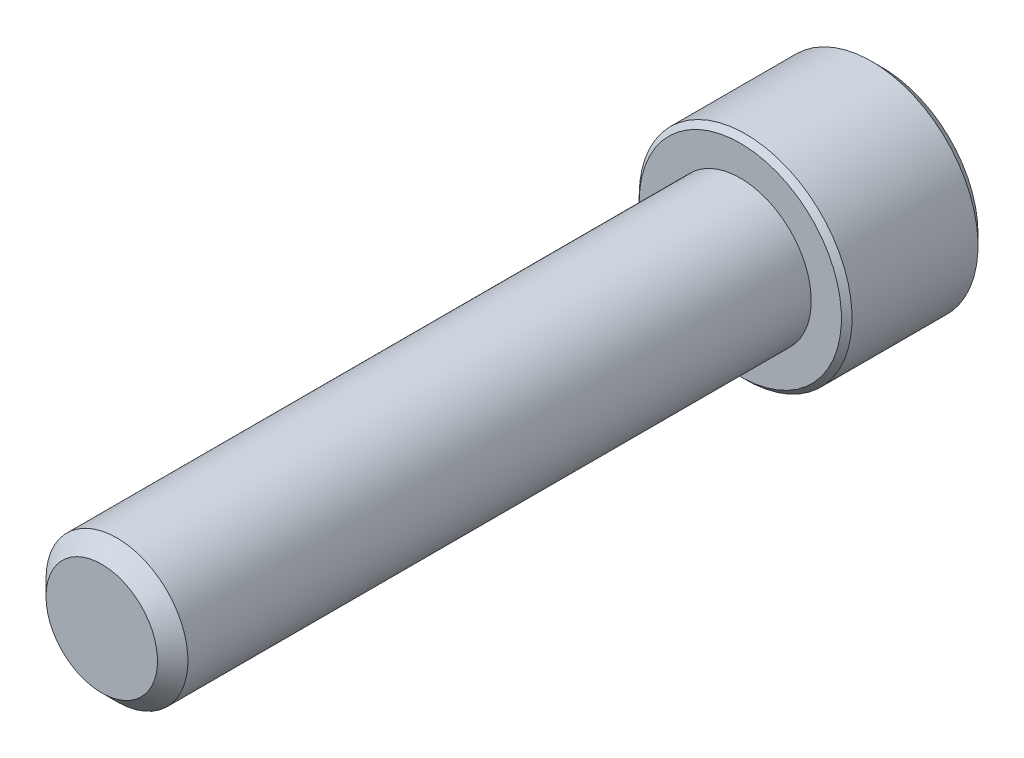
ISO-10303-21;
HEADER;
FILE_DESCRIPTION(('STEP AP214'),'2;1');
FILE_NAME('part.step','',(''),(''),'','','');
FILE_SCHEMA(('AUTOMOTIVE_DESIGN { 1 0 10303 214 1 1 1 1 }'));
ENDSEC;
DATA;
#1=APPLICATION_CONTEXT('core data for automotive mechanical design processes');
#2=APPLICATION_PROTOCOL_DEFINITION('international standard','automotive_design',2000,#1);
#3=PRODUCT_CONTEXT('',#1,'mechanical');
#4=PRODUCT('Part','Part','',(#3));
#5=PRODUCT_RELATED_PRODUCT_CATEGORY('part','',(#4));
#6=PRODUCT_DEFINITION_FORMATION('','',#4);
#7=PRODUCT_DEFINITION_CONTEXT('part definition',#1,'design');
#8=PRODUCT_DEFINITION('design','',#6,#7);
#9=PRODUCT_DEFINITION_SHAPE('','',#8);
#10=(LENGTH_UNIT() NAMED_UNIT(*) SI_UNIT(.MILLI.,.METRE.));
#11=(NAMED_UNIT(*) PLANE_ANGLE_UNIT() SI_UNIT($,.RADIAN.));
#12=(NAMED_UNIT(*) SI_UNIT($,.STERADIAN.) SOLID_ANGLE_UNIT());
#13=UNCERTAINTY_MEASURE_WITH_UNIT(LENGTH_MEASURE(1.E-05),#10,'distance_accuracy_value','');
#14=(GEOMETRIC_REPRESENTATION_CONTEXT(3) GLOBAL_UNCERTAINTY_ASSIGNED_CONTEXT((#13)) GLOBAL_UNIT_ASSIGNED_CONTEXT((#10,
#11,#12)) REPRESENTATION_CONTEXT('',''));
#15=CARTESIAN_POINT('',(0.,0.,0.));
#16=DIRECTION('',(0.,0.,1.));
#17=DIRECTION('',(1.,0.,0.));
#18=AXIS2_PLACEMENT_3D('',#15,#16,#17);
#19=CARTESIAN_POINT('',(0.,0.,-28.575));
#20=DIRECTION('',(0.,0.,1.));
#21=DIRECTION('',(1.,0.,0.));
#22=AXIS2_PLACEMENT_3D('',#19,#20,#21);
#23=CYLINDRICAL_SURFACE('',#22,3.175);
#24=CARTESIAN_POINT('',(0.,0.,-0.680357142857146));
#25=DIRECTION('',(0.,0.,1.));
#26=DIRECTION('',(1.,0.,0.));
#27=AXIS2_PLACEMENT_3D('',#24,#25,#26);
#28=CIRCLE('',#27,3.175);
#29=CARTESIAN_POINT('',(-3.175,0.,-0.680357142857146));
#30=VERTEX_POINT('',#29);
#31=EDGE_CURVE('E116',#30,#30,#28,.F.);
#32=ORIENTED_EDGE('',*,*,#31,.T.);
#33=EDGE_LOOP('',(#32));
#34=FACE_BOUND('',#33,.T.);
#35=CARTESIAN_POINT('',(0.,0.,-28.575));
#36=DIRECTION('',(0.,0.,-1.));
#37=DIRECTION('',(-1.,0.,0.));
#38=AXIS2_PLACEMENT_3D('',#35,#36,#37);
#39=CIRCLE('',#38,3.175);
#40=CARTESIAN_POINT('',(-3.175,0.,-28.575));
#41=VERTEX_POINT('',#40);
#42=EDGE_CURVE('E228',#41,#41,#39,.F.);
#43=ORIENTED_EDGE('',*,*,#42,.T.);
#44=EDGE_LOOP('',(#43));
#45=FACE_BOUND('',#44,.T.);
#46=ADVANCED_FACE('F39',(#34,#45),#23,.T.);
#47=CARTESIAN_POINT('',(0.,0.,0.));
#48=DIRECTION('',(0.,0.,1.));
#49=DIRECTION('',(1.,0.,0.));
#50=AXIS2_PLACEMENT_3D('',#47,#48,#49);
#51=PLANE('',#50);
#52=CARTESIAN_POINT('',(0.,0.,0.));
#53=DIRECTION('',(0.,0.,1.));
#54=DIRECTION('',(1.,0.,0.));
#55=AXIS2_PLACEMENT_3D('',#52,#53,#54);
#56=CIRCLE('',#55,2.49464285714286);
#57=CARTESIAN_POINT('',(-2.49464285714286,0.,0.));
#58=VERTEX_POINT('',#57);
#59=EDGE_CURVE('E226',#58,#58,#56,.T.);
#60=ORIENTED_EDGE('',*,*,#59,.T.);
#61=EDGE_LOOP('',(#60));
#62=FACE_BOUND('',#61,.T.);
#63=ADVANCED_FACE('F204',(#62),#51,.T.);
#64=CARTESIAN_POINT('',(0.,0.,0.));
#65=DIRECTION('',(0.,0.,-1.));
#66=DIRECTION('',(-1.,0.,0.));
#67=AXIS2_PLACEMENT_3D('',#64,#65,#66);
#68=CONICAL_SURFACE('',#67,2.49464285714286,0.785398163397448);
#69=CARTESIAN_POINT('',(-3.175,0.,-0.680357142857146));
#70=CARTESIAN_POINT('',(-3.16791294642857,0.,-0.673270089285717));
#71=CARTESIAN_POINT('',(-3.16082589285714,0.,-0.666183035714289));
#72=CARTESIAN_POINT('',(-3.14665178571429,0.,-0.652008928571431));
#73=CARTESIAN_POINT('',(-3.13956473214286,0.,-0.644921875000003));
#74=CARTESIAN_POINT('',(-3.125390625,0.,-0.630747767857146));
#75=CARTESIAN_POINT('',(-3.11830357142857,0.,-0.623660714285717));
#76=CARTESIAN_POINT('',(-3.10412946428571,0.,-0.60948660714286));
#77=CARTESIAN_POINT('',(-3.09704241071429,0.,-0.602399553571431));
#78=CARTESIAN_POINT('',(-3.08286830357143,0.,-0.588225446428574));
#79=CARTESIAN_POINT('',(-3.07578125,0.,-0.581138392857145));
#80=CARTESIAN_POINT('',(-3.06160714285714,0.,-0.566964285714288));
#81=CARTESIAN_POINT('',(-3.05452008928571,0.,-0.55987723214286));
#82=CARTESIAN_POINT('',(-3.04034598214286,0.,-0.545703125000003));
#83=CARTESIAN_POINT('',(-3.03325892857143,0.,-0.538616071428574));
#84=CARTESIAN_POINT('',(-3.01908482142857,0.,-0.524441964285716));
#85=CARTESIAN_POINT('',(-3.01199776785714,0.,-0.517354910714288));
#86=CARTESIAN_POINT('',(-2.99782366071428,0.,-0.503180803571431));
#87=CARTESIAN_POINT('',(-2.99073660714286,0.,-0.496093750000002));
#88=CARTESIAN_POINT('',(-2.9765625,0.,-0.481919642857145));
#89=CARTESIAN_POINT('',(-2.96947544642857,0.,-0.474832589285716));
#90=CARTESIAN_POINT('',(-2.95530133928571,0.,-0.460658482142859));
#91=CARTESIAN_POINT('',(-2.94821428571429,0.,-0.453571428571431));
#92=CARTESIAN_POINT('',(-2.93404017857143,0.,-0.439397321428573));
#93=CARTESIAN_POINT('',(-2.926953125,0.,-0.432310267857145));
#94=CARTESIAN_POINT('',(-2.91277901785714,0.,-0.418136160714288));
#95=CARTESIAN_POINT('',(-2.90569196428571,0.,-0.411049107142859));
#96=CARTESIAN_POINT('',(-2.89151785714286,0.,-0.396875000000002));
#97=CARTESIAN_POINT('',(-2.88443080357143,0.,-0.389787946428573));
#98=CARTESIAN_POINT('',(-2.87025669642857,0.,-0.375613839285716));
#99=CARTESIAN_POINT('',(-2.86316964285714,0.,-0.368526785714287));
#100=CARTESIAN_POINT('',(-2.84899553571428,0.,-0.35435267857143));
#101=CARTESIAN_POINT('',(-2.84190848214286,0.,-0.347265625000002));
#102=CARTESIAN_POINT('',(-2.827734375,0.,-0.333091517857144));
#103=CARTESIAN_POINT('',(-2.82064732142857,0.,-0.326004464285716));
#104=CARTESIAN_POINT('',(-2.80647321428571,0.,-0.311830357142859));
#105=CARTESIAN_POINT('',(-2.79938616071428,0.,-0.30474330357143));
#106=CARTESIAN_POINT('',(-2.78521205357143,0.,-0.290569196428573));
#107=CARTESIAN_POINT('',(-2.778125,0.,-0.283482142857144));
#108=CARTESIAN_POINT('',(-2.76395089285714,0.,-0.269308035714287));
#109=CARTESIAN_POINT('',(-2.75686383928571,0.,-0.262220982142858));
#110=CARTESIAN_POINT('',(-2.74268973214286,0.,-0.248046875000001));
#111=CARTESIAN_POINT('',(-2.73560267857143,0.,-0.240959821428572));
#112=CARTESIAN_POINT('',(-2.72142857142857,0.,-0.226785714285715));
#113=CARTESIAN_POINT('',(-2.71434151785714,0.,-0.219698660714287));
#114=CARTESIAN_POINT('',(-2.70016741071428,0.,-0.20552455357143));
#115=CARTESIAN_POINT('',(-2.69308035714286,0.,-0.198437500000001));
#116=CARTESIAN_POINT('',(-2.67890625,0.,-0.184263392857144));
#117=CARTESIAN_POINT('',(-2.67181919642857,0.,-0.177176339285715));
#118=CARTESIAN_POINT('',(-2.65764508928571,0.,-0.163002232142858));
#119=CARTESIAN_POINT('',(-2.65055803571428,0.,-0.155915178571429));
#120=CARTESIAN_POINT('',(-2.63638392857143,0.,-0.141741071428572));
#121=CARTESIAN_POINT('',(-2.629296875,0.,-0.134654017857143));
#122=CARTESIAN_POINT('',(-2.61512276785714,0.,-0.120479910714286));
#123=CARTESIAN_POINT('',(-2.60803571428571,0.,-0.113392857142858));
#124=CARTESIAN_POINT('',(-2.59386160714286,0.,-0.0992187500000004));
#125=CARTESIAN_POINT('',(-2.58677455357143,0.,-0.0921316964285718));
#126=CARTESIAN_POINT('',(-2.57260044642857,0.,-0.0779575892857146));
#127=CARTESIAN_POINT('',(-2.56551339285714,0.,-0.070870535714286));
#128=CARTESIAN_POINT('',(-2.55133928571428,0.,-0.0566964285714288));
#129=CARTESIAN_POINT('',(-2.54425223214286,0.,-0.0496093750000002));
#130=CARTESIAN_POINT('',(-2.530078125,0.,-0.035435267857143));
#131=CARTESIAN_POINT('',(-2.52299107142857,0.,-0.0283482142857144));
#132=CARTESIAN_POINT('',(-2.50881696428571,0.,-0.0141741071428571));
#133=CARTESIAN_POINT('',(-2.50172991071428,0.,-0.00708705357142851));
#134=CARTESIAN_POINT('',(-2.49464285714286,0.,0.));
#135=B_SPLINE_CURVE_WITH_KNOTS('',3,(#69,#70,#71,#72,#73,#74,#75,#76,#77,#78,#79,#80,#81,#82,
#83,#84,#85,#86,#87,#88,#89,#90,#91,#92,#93,#94,#95,#96,#97,#98,#99,#100,#101,#102,#103,#104,
#105,#106,#107,#108,#109,#110,#111,#112,#113,#114,#115,#116,#117,#118,#119,#120,#121,#122,#123,
#124,#125,#126,#127,#128,#129,#130,#131,#132,#133,#134),.UNSPECIFIED.,.F.,.F.,(4,2,2,2,2,2,2,2,
2,2,2,2,2,2,2,2,2,2,2,2,2,2,2,2,2,2,2,2,2,2,2,2,4),(0.,0.0300678218339368,0.0601356436678739,
0.090203465501811,0.120271287335748,0.150339109169685,0.180406931003622,0.210474752837559,
0.240542574671496,0.270610396505433,0.30067821833937,0.330746040173307,0.360813862007244,
0.390881683841181,0.420949505675118,0.451017327509055,0.481085149342992,0.511152971176929,
0.541220793010866,0.571288614844803,0.60135643667874,0.631424258512677,0.661492080346614,
0.691559902180551,0.721627724014488,0.751695545848425,0.781763367682362,0.8118311895163,
0.841899011350236,0.871966833184173,0.902034655018111,0.932102476852047,0.962170298685984),.UNSPECIFIED.);
#136=EDGE_CURVE('BSEAM210',#30,#58,#135,.T.);
#137=ORIENTED_EDGE('',*,*,#31,.F.);
#138=ORIENTED_EDGE('',*,*,#59,.F.);
#139=ORIENTED_EDGE('',*,*,#136,.T.);
#140=ORIENTED_EDGE('',*,*,#136,.F.);
#141=EDGE_LOOP('',(#137,#139,#138,#140));
#142=FACE_BOUND('',#141,.T.);
#143=ADVANCED_FACE('F210',(#142),#68,.T.);
#144=CARTESIAN_POINT('',(0.,0.,-34.925));
#145=DIRECTION('',(0.,0.,1.));
#146=DIRECTION('',(1.,0.,0.));
#147=AXIS2_PLACEMENT_3D('',#144,#145,#146);
#148=CYLINDRICAL_SURFACE('',#147,4.7625);
#149=CARTESIAN_POINT('',(0.,0.,-28.813125));
#150=DIRECTION('',(0.,0.,-1.));
#151=DIRECTION('',(-1.,0.,0.));
#152=AXIS2_PLACEMENT_3D('',#149,#150,#151);
#153=CIRCLE('',#152,4.7625);
#154=CARTESIAN_POINT('',(-4.7625,0.,-28.813125));
#155=VERTEX_POINT('',#154);
#156=EDGE_CURVE('E48',#155,#155,#153,.T.);
#157=ORIENTED_EDGE('',*,*,#156,.T.);
#158=EDGE_LOOP('',(#157));
#159=FACE_BOUND('',#158,.T.);
#160=CARTESIAN_POINT('',(0.,0.,-34.44875));
#161=DIRECTION('',(0.,0.,-1.));
#162=DIRECTION('',(-1.,0.,0.));
#163=AXIS2_PLACEMENT_3D('',#160,#161,#162);
#164=CIRCLE('',#163,4.7625);
#165=CARTESIAN_POINT('',(-4.7625,0.,-34.44875));
#166=VERTEX_POINT('',#165);
#167=EDGE_CURVE('E185',#166,#166,#164,.F.);
#168=ORIENTED_EDGE('',*,*,#167,.T.);
#169=EDGE_LOOP('',(#168));
#170=FACE_BOUND('',#169,.T.);
#171=ADVANCED_FACE('F192',(#159,#170),#148,.T.);
#172=CARTESIAN_POINT('',(0.,0.,-34.925));
#173=DIRECTION('',(0.,0.,-1.));
#174=DIRECTION('',(-1.,0.,0.));
#175=AXIS2_PLACEMENT_3D('',#172,#173,#174);
#176=PLANE('',#175);
#177=CARTESIAN_POINT('',(0.,0.,-34.925));
#178=DIRECTION('',(0.,0.,-1.));
#179=DIRECTION('',(-1.,0.,0.));
#180=AXIS2_PLACEMENT_3D('',#177,#178,#179);
#181=CIRCLE('',#180,4.28625000000001);
#182=CARTESIAN_POINT('',(-4.28625000000001,0.,-34.925));
#183=VERTEX_POINT('',#182);
#184=EDGE_CURVE('E115',#183,#183,#181,.T.);
#185=ORIENTED_EDGE('',*,*,#184,.T.);
#186=EDGE_LOOP('',(#185));
#187=FACE_BOUND('',#186,.T.);
#188=CARTESIAN_POINT('',(0.,0.,-34.925));
#189=DIRECTION('',(0.,0.,-1.));
#190=DIRECTION('',(-1.,0.,0.));
#191=AXIS2_PLACEMENT_3D('',#188,#189,#190);
#192=CIRCLE('',#191,2.74963065701559);
#193=CARTESIAN_POINT('',(-2.38125,1.37481532850779,-34.925));
#194=VERTEX_POINT('',#193);
#195=CARTESIAN_POINT('',(0.,2.74963065701559,-34.925));
#196=VERTEX_POINT('',#195);
#197=EDGE_CURVE('E94',#194,#196,#192,.T.);
#198=ORIENTED_EDGE('',*,*,#197,.F.);
#199=CARTESIAN_POINT('',(-2.38125,-1.3748153285078,-34.925));
#200=VERTEX_POINT('',#199);
#201=EDGE_CURVE('E54',#200,#194,#192,.T.);
#202=ORIENTED_EDGE('',*,*,#201,.F.);
#203=CARTESIAN_POINT('',(0.,-2.74963065701559,-34.925));
#204=VERTEX_POINT('',#203);
#205=EDGE_CURVE('E301',#204,#200,#192,.T.);
#206=ORIENTED_EDGE('',*,*,#205,.F.);
#207=CARTESIAN_POINT('',(2.38125,-1.3748153285078,-34.925));
#208=VERTEX_POINT('',#207);
#209=EDGE_CURVE('E61',#208,#204,#192,.T.);
#210=ORIENTED_EDGE('',*,*,#209,.F.);
#211=CARTESIAN_POINT('',(2.38125,1.3748153285078,-34.925));
#212=VERTEX_POINT('',#211);
#213=EDGE_CURVE('E139',#212,#208,#192,.T.);
#214=ORIENTED_EDGE('',*,*,#213,.F.);
#215=EDGE_CURVE('E104',#196,#212,#192,.T.);
#216=ORIENTED_EDGE('',*,*,#215,.F.);
#217=EDGE_LOOP('',(#198,#202,#206,#210,#214,#216));
#218=FACE_BOUND('',#217,.T.);
#219=ADVANCED_FACE('F138',(#187,#218),#176,.T.);
#220=CARTESIAN_POINT('',(0.,0.,-28.575));
#221=DIRECTION('',(0.,0.,-1.));
#222=DIRECTION('',(-1.,0.,0.));
#223=AXIS2_PLACEMENT_3D('',#220,#221,#222);
#224=PLANE('',#223);
#225=CARTESIAN_POINT('',(0.,0.,-28.575));
#226=DIRECTION('',(0.,0.,-1.));
#227=DIRECTION('',(-1.,0.,0.));
#228=AXIS2_PLACEMENT_3D('',#225,#226,#227);
#229=CIRCLE('',#228,4.524375);
#230=CARTESIAN_POINT('',(-4.524375,0.,-28.575));
#231=VERTEX_POINT('',#230);
#232=EDGE_CURVE('E11',#231,#231,#229,.F.);
#233=ORIENTED_EDGE('',*,*,#232,.T.);
#234=EDGE_LOOP('',(#233));
#235=FACE_BOUND('',#234,.T.);
#236=ORIENTED_EDGE('',*,*,#42,.F.);
#237=EDGE_LOOP('',(#236));
#238=FACE_BOUND('',#237,.T.);
#239=ADVANCED_FACE('F318',(#235,#238),#224,.F.);
#240=CARTESIAN_POINT('',(0.,0.,-34.925));
#241=DIRECTION('',(0.,0.,-1.));
#242=DIRECTION('',(-1.,0.,0.));
#243=AXIS2_PLACEMENT_3D('',#240,#241,#242);
#244=CONICAL_SURFACE('',#243,2.74963065701559,0.78539816339745);
#245=ORIENTED_EDGE('',*,*,#215,.T.);
#246=CARTESIAN_POINT('',(-0.000199999999998987,2.74974612706943,-34.9251154773272));
#247=CARTESIAN_POINT('',(0.0816567823790509,2.70248609172789,-34.8778948967095));
#248=CARTESIAN_POINT('',(0.164882333771761,2.65443579722785,-34.8334475752929));
#249=CARTESIAN_POINT('',(0.334588480838041,2.556455907536,-34.7520654569856));
#250=CARTESIAN_POINT('',(0.421085217353104,2.50651699342501,-34.7151759430951));
#251=CARTESIAN_POINT('',(0.595501774009044,2.40581754748857,-34.6519834131659));
#252=CARTESIAN_POINT('',(0.683377171180676,2.35508266327638,-34.6255215587295));
#253=CARTESIAN_POINT('',(0.861062594070877,2.25249593653965,-34.5847515156161));
#254=CARTESIAN_POINT('',(0.950867191185872,2.20064722822085,-34.5704128915305));
#255=CARTESIAN_POINT('',(1.10563960313034,2.11128933452158,-34.5574757847701));
#256=CARTESIAN_POINT('',(1.17040744896962,2.07389560129144,-34.5555606046532));
#257=CARTESIAN_POINT('',(1.29983727933557,1.99916925388849,-34.5587866227677));
#258=CARTESIAN_POINT('',(1.36449921879336,1.96183666573621,-34.5639302948571));
#259=CARTESIAN_POINT('',(1.4932125485774,1.88752399013711,-34.5809813108716));
#260=CARTESIAN_POINT('',(1.55726317423486,1.85054434417201,-34.5928962213493));
#261=CARTESIAN_POINT('',(1.68425683890527,1.77722451768916,-34.622835672352));
#262=CARTESIAN_POINT('',(1.74719996243583,1.74088428837517,-34.6408597445185));
#263=CARTESIAN_POINT('',(1.90842615073218,1.64780030516185,-34.6943688075524));
#264=CARTESIAN_POINT('',(2.00570949128784,1.59163374230437,-34.7338874208722));
#265=CARTESIAN_POINT('',(2.14875606262557,1.50904576583588,-34.8006003435508));
#266=CARTESIAN_POINT('',(2.19589628894396,1.48182934348129,-34.8240402091113));
#267=CARTESIAN_POINT('',(2.28930352636664,1.42790064981106,-34.8730566766595));
#268=CARTESIAN_POINT('',(2.33557105249682,1.40118808114506,-34.8986319667669));
#269=CARTESIAN_POINT('',(2.38145,1.37469985845396,-34.9251154773272));
#270=B_SPLINE_CURVE_WITH_KNOTS('',3,(#246,#247,#248,#249,#250,#251,#252,#253,#254,#255,#256,
#257,#258,#259,#260,#261,#262,#263,#264,#265,#266,#267,#268,#269),.UNSPECIFIED.,.F.,.F.,(4,2,2,
2,2,2,2,2,2,2,2,4),(0.,0.317196610611949,0.636241461041219,0.950218950629222,1.26340583824126,
1.48752413747844,1.71172100167747,1.93616888974082,2.16059957440836,2.51709639744763,
2.69486147369099,2.87251813383153),.UNSPECIFIED.);
#271=EDGE_CURVE('E109',#196,#212,#270,.T.);
#272=ORIENTED_EDGE('',*,*,#271,.F.);
#273=EDGE_LOOP('',(#245,#272));
#274=FACE_BOUND('',#273,.T.);
#275=ADVANCED_FACE('F110',(#274),#244,.F.);
#276=ORIENTED_EDGE('',*,*,#213,.T.);
#277=CARTESIAN_POINT('',(2.38125,-2.74194290589386,-35.8069808945799));
#278=CARTESIAN_POINT('',(2.38125,-2.67517961056039,-35.7565846679781));
#279=CARTESIAN_POINT('',(2.38125,-2.60804251112752,-35.7066755875907));
#280=CARTESIAN_POINT('',(2.38125,-2.47287325055307,-35.6080498309857));
#281=CARTESIAN_POINT('',(2.38125,-2.40484086895313,-35.5593334572448));
#282=CARTESIAN_POINT('',(2.38125,-2.26723593505441,-35.4629648544534));
#283=CARTESIAN_POINT('',(2.38125,-2.19765553346049,-35.4153237954326));
#284=CARTESIAN_POINT('',(2.38125,-2.05731367842203,-35.3218199233866));
#285=CARTESIAN_POINT('',(2.38125,-1.98655230892573,-35.2759569847287));
#286=CARTESIAN_POINT('',(2.38125,-1.83957751909225,-35.1838459007133));
#287=CARTESIAN_POINT('',(2.38125,-1.76328361992075,-35.1377255173928));
#288=CARTESIAN_POINT('',(2.38125,-1.6089135770446,-35.0485183038905));
#289=CARTESIAN_POINT('',(2.38125,-1.53083712149137,-35.0054320099754));
#290=CARTESIAN_POINT('',(2.38125,-1.37291620334514,-34.9232265014712));
#291=CARTESIAN_POINT('',(2.38125,-1.29307799938228,-34.8840953578519));
#292=CARTESIAN_POINT('',(2.38125,-1.13121425093132,-34.8106679503152));
#293=CARTESIAN_POINT('',(2.38125,-1.04918943681795,-34.7763700954538));
#294=CARTESIAN_POINT('',(2.38125,-0.88953525675927,-34.7163546314156));
#295=CARTESIAN_POINT('',(2.38125,-0.812083865770257,-34.690168478432));
#296=CARTESIAN_POINT('',(2.38125,-0.655316366527661,-34.6440097514868));
#297=CARTESIAN_POINT('',(2.38125,-0.576000130216829,-34.6240376055837));
#298=CARTESIAN_POINT('',(2.38125,-0.417295761573374,-34.5916821452488));
#299=CARTESIAN_POINT('',(2.38125,-0.337934576883846,-34.5791688083547));
#300=CARTESIAN_POINT('',(2.38125,-0.178363852969583,-34.5619738601659));
#301=CARTESIAN_POINT('',(2.38125,-0.098154461961766,-34.5572909026126));
#302=CARTESIAN_POINT('',(2.38125,0.0594188034321301,-34.5561044408392));
#303=CARTESIAN_POINT('',(2.38125,0.136780588525994,-34.5593110105046));
#304=CARTESIAN_POINT('',(2.38125,0.290840960607339,-34.5730870567428));
#305=CARTESIAN_POINT('',(2.38125,0.367539482435409,-34.5836572485871));
#306=CARTESIAN_POINT('',(2.38125,0.521017492835388,-34.6117628298525));
#307=CARTESIAN_POINT('',(2.38125,0.597774958394048,-34.6294167489314));
#308=CARTESIAN_POINT('',(2.38125,0.749609814257009,-34.6707513962434));
#309=CARTESIAN_POINT('',(2.38125,0.824687344568026,-34.6944316201904));
#310=CARTESIAN_POINT('',(2.38125,1.06107814410025,-34.777894862956));
#311=CARTESIAN_POINT('',(2.38125,1.2190478622181,-34.8471839270396));
#312=CARTESIAN_POINT('',(2.38125,1.45021000267341,-34.9626640838597));
#313=CARTESIAN_POINT('',(2.38125,1.52644290442584,-35.0031730572583));
#314=CARTESIAN_POINT('',(2.38125,1.67717618538172,-35.0873026892371));
#315=CARTESIAN_POINT('',(2.38125,1.7516768735884,-35.1309227870999));
#316=CARTESIAN_POINT('',(2.38125,1.89548152088328,-35.218412556489));
#317=CARTESIAN_POINT('',(2.38125,1.96485959608998,-35.2621617927418));
#318=CARTESIAN_POINT('',(2.38125,2.10242624411169,-35.3515011587306));
#319=CARTESIAN_POINT('',(2.38125,2.17061472626633,-35.3970914279041));
#320=CARTESIAN_POINT('',(2.38125,2.30540317317354,-35.4894060050932));
#321=CARTESIAN_POINT('',(2.38125,2.37201154222166,-35.5361180928962));
#322=CARTESIAN_POINT('',(2.38125,2.50431800054459,-35.6307775780183));
#323=CARTESIAN_POINT('',(2.38125,2.57001633510792,-35.6787246320963));
#324=CARTESIAN_POINT('',(2.38125,2.63533378855947,-35.7271767335425));
#325=B_SPLINE_CURVE_WITH_KNOTS('',3,(#277,#278,#279,#280,#281,#282,#283,#284,#285,#286,#287,
#288,#289,#290,#291,#292,#293,#294,#295,#296,#297,#298,#299,#300,#301,#302,#303,#304,#305,#306,
#307,#308,#309,#310,#311,#312,#313,#314,#315,#316,#317,#318,#319,#320,#321,#322,#323,#324),
.UNSPECIFIED.,.F.,.F.,(4,2,2,2,2,2,2,2,2,2,2,2,2,2,2,2,2,2,2,2,2,2,2,4),(0.,0.250951284009982,
0.50196556482788,0.754924775973582,1.00786608164542,1.27526207798892,1.54270521780082,
1.80931602029339,2.07583885812519,2.32089852590464,2.56597507114536,2.80664400307698,
3.04727155311265,3.27918940971451,3.51112979698762,3.74712477407482,3.98310000940111,
4.49898139184704,4.75794323931354,5.01685853149448,5.26288960015361,5.50893933794672,
5.75299038397142,5.99697431627971),.UNSPECIFIED.);
#326=EDGE_CURVE('E103',#212,#208,#325,.F.);
#327=ORIENTED_EDGE('',*,*,#326,.F.);
#328=EDGE_LOOP('',(#276,#327));
#329=FACE_BOUND('',#328,.T.);
#330=ADVANCED_FACE('F312',(#329),#244,.F.);
#331=ORIENTED_EDGE('',*,*,#209,.T.);
#332=CARTESIAN_POINT('',(2.38145,-1.37469985845396,-34.9251154773272));
#333=CARTESIAN_POINT('',(2.29959321762095,-1.4219598937955,-34.8778948967095));
#334=CARTESIAN_POINT('',(2.21636766622824,-1.47001018829554,-34.8334475752929));
#335=CARTESIAN_POINT('',(2.04666151916196,-1.56799007798739,-34.7520654569856));
#336=CARTESIAN_POINT('',(1.96016478264689,-1.61792899209838,-34.7151759430951));
#337=CARTESIAN_POINT('',(1.78574822599096,-1.71862843803482,-34.6519834131659));
#338=CARTESIAN_POINT('',(1.69787282881932,-1.76936332224701,-34.6255215587295));
#339=CARTESIAN_POINT('',(1.52018740592912,-1.87195004898374,-34.5847515156161));
#340=CARTESIAN_POINT('',(1.43038280881413,-1.92379875730254,-34.5704128915305));
#341=CARTESIAN_POINT('',(1.27561039686966,-2.01315665100181,-34.5574757847701));
#342=CARTESIAN_POINT('',(1.21084255103038,-2.05055038423195,-34.5555606046532));
#343=CARTESIAN_POINT('',(1.08141272066442,-2.1252767316349,-34.5587866227677));
#344=CARTESIAN_POINT('',(1.01675078120664,-2.16260931978718,-34.5639302948571));
#345=CARTESIAN_POINT('',(0.888037451422602,-2.23692199538629,-34.5809813108716));
#346=CARTESIAN_POINT('',(0.823986825765144,-2.27390164135138,-34.5928962213493));
#347=CARTESIAN_POINT('',(0.696993161094725,-2.34722146783423,-34.622835672352));
#348=CARTESIAN_POINT('',(0.634050037564174,-2.38356169714823,-34.6408597445185));
#349=CARTESIAN_POINT('',(0.472823849267819,-2.47664568036154,-34.6943688075524));
#350=CARTESIAN_POINT('',(0.375540508712161,-2.53281224321902,-34.7338874208722));
#351=CARTESIAN_POINT('',(0.232493937374433,-2.61540021968751,-34.8006003435508));
#352=CARTESIAN_POINT('',(0.185353711056038,-2.64261664204209,-34.8240402091113));
#353=CARTESIAN_POINT('',(0.0919464736333649,-2.69654533571233,-34.8730566766595));
#354=CARTESIAN_POINT('',(0.0456789475031815,-2.72325790437833,-34.8986319667669));
#355=CARTESIAN_POINT('',(-0.000199999999997933,-2.74974612706943,-34.9251154773272));
#356=B_SPLINE_CURVE_WITH_KNOTS('',3,(#332,#333,#334,#335,#336,#337,#338,#339,#340,#341,#342,
#343,#344,#345,#346,#347,#348,#349,#350,#351,#352,#353,#354,#355),.UNSPECIFIED.,.F.,.F.,(4,2,2,
2,2,2,2,2,2,2,2,4),(0.,0.317196610611951,0.636241461041219,0.950218950629224,1.26340583824126,
1.48752413747844,1.71172100167747,1.93616888974082,2.16059957440836,2.51709639744762,
2.69486147369098,2.87251813383153),.UNSPECIFIED.);
#357=EDGE_CURVE('E152',#208,#204,#356,.T.);
#358=ORIENTED_EDGE('',*,*,#357,.F.);
#359=EDGE_LOOP('',(#331,#358));
#360=FACE_BOUND('',#359,.T.);
#361=ADVANCED_FACE('F309',(#360),#244,.F.);
#362=ORIENTED_EDGE('',*,*,#205,.T.);
#363=CARTESIAN_POINT('',(0.000199999999999919,-2.74974612706943,-34.9251154773272));
#364=CARTESIAN_POINT('',(-0.0816567823790508,-2.70248609172789,-34.8778948967095));
#365=CARTESIAN_POINT('',(-0.164882333771762,-2.65443579722785,-34.8334475752929));
#366=CARTESIAN_POINT('',(-0.334588480838042,-2.556455907536,-34.7520654569856));
#367=CARTESIAN_POINT('',(-0.421085217353104,-2.50651699342501,-34.7151759430951));
#368=CARTESIAN_POINT('',(-0.595501774009043,-2.40581754748857,-34.6519834131659));
#369=CARTESIAN_POINT('',(-0.683377171180676,-2.35508266327639,-34.6255215587295));
#370=CARTESIAN_POINT('',(-0.861062594070877,-2.25249593653965,-34.5847515156161));
#371=CARTESIAN_POINT('',(-0.950867191185872,-2.20064722822085,-34.5704128915305));
#372=CARTESIAN_POINT('',(-1.10563960313034,-2.11128933452158,-34.5574757847701));
#373=CARTESIAN_POINT('',(-1.17040744896962,-2.07389560129144,-34.5555606046532));
#374=CARTESIAN_POINT('',(-1.29983727933558,-1.99916925388849,-34.5587866227677));
#375=CARTESIAN_POINT('',(-1.36449921879336,-1.96183666573622,-34.5639302948571));
#376=CARTESIAN_POINT('',(-1.4932125485774,-1.88752399013711,-34.5809813108716));
#377=CARTESIAN_POINT('',(-1.55726317423486,-1.85054434417201,-34.5928962213493));
#378=CARTESIAN_POINT('',(-1.68425683890527,-1.77722451768917,-34.622835672352));
#379=CARTESIAN_POINT('',(-1.74719996243583,-1.74088428837517,-34.6408597445185));
#380=CARTESIAN_POINT('',(-1.90842615073218,-1.64780030516185,-34.6943688075524));
#381=CARTESIAN_POINT('',(-2.00570949128784,-1.59163374230437,-34.7338874208722));
#382=CARTESIAN_POINT('',(-2.14875606262557,-1.50904576583588,-34.8006003435508));
#383=CARTESIAN_POINT('',(-2.19589628894397,-1.48182934348129,-34.8240402091113));
#384=CARTESIAN_POINT('',(-2.28930352636664,-1.42790064981106,-34.8730566766595));
#385=CARTESIAN_POINT('',(-2.33557105249682,-1.40118808114506,-34.8986319667669));
#386=CARTESIAN_POINT('',(-2.38145,-1.37469985845396,-34.9251154773272));
#387=B_SPLINE_CURVE_WITH_KNOTS('',3,(#363,#364,#365,#366,#367,#368,#369,#370,#371,#372,#373,
#374,#375,#376,#377,#378,#379,#380,#381,#382,#383,#384,#385,#386),.UNSPECIFIED.,.F.,.F.,(4,2,2,
2,2,2,2,2,2,2,2,4),(0.,0.317196610611951,0.636241461041218,0.950218950629223,1.26340583824126,
1.48752413747844,1.71172100167747,1.93616888974082,2.16059957440836,2.51709639744763,
2.69486147369099,2.87251813383154),.UNSPECIFIED.);
#388=EDGE_CURVE('E278',#204,#200,#387,.T.);
#389=ORIENTED_EDGE('',*,*,#388,.F.);
#390=EDGE_LOOP('',(#362,#389));
#391=FACE_BOUND('',#390,.T.);
#392=ADVANCED_FACE('F306',(#391),#244,.F.);
#393=ORIENTED_EDGE('',*,*,#201,.T.);
#394=CARTESIAN_POINT('',(-2.38125,-2.7419429062928,-35.8069808948811));
#395=CARTESIAN_POINT('',(-2.38125,-2.67517961094813,-35.7565846682677));
#396=CARTESIAN_POINT('',(-2.38125,-2.60804251150403,-35.7066755878687));
#397=CARTESIAN_POINT('',(-2.38125,-2.47287325090701,-35.6080498312406));
#398=CARTESIAN_POINT('',(-2.38125,-2.40484086929572,-35.5593334574882));
#399=CARTESIAN_POINT('',(-2.38125,-2.26723593537394,-35.4629648546737));
#400=CARTESIAN_POINT('',(-2.38125,-2.1976555337683,-35.4153237956413));
#401=CARTESIAN_POINT('',(-2.38125,-2.05731367870617,-35.3218199235723));
#402=CARTESIAN_POINT('',(-2.38125,-1.98655230919793,-35.275956984903));
#403=CARTESIAN_POINT('',(-2.38125,-1.83957751933871,-35.1838459008639));
#404=CARTESIAN_POINT('',(-2.38125,-1.76328362015337,-35.1377255175311));
#405=CARTESIAN_POINT('',(-2.38125,-1.60891357724903,-35.0485183040048));
#406=CARTESIAN_POINT('',(-2.38125,-1.53083712168147,-35.005432010078));
#407=CARTESIAN_POINT('',(-2.38125,-1.37291620350604,-34.9232265015513));
#408=CARTESIAN_POINT('',(-2.38125,-1.29307799952833,-34.8840953579213));
#409=CARTESIAN_POINT('',(-2.38125,-1.13121425104688,-34.8106679503644));
#410=CARTESIAN_POINT('',(-2.38125,-1.04918943691786,-34.7763700954936));
#411=CARTESIAN_POINT('',(-2.38125,-0.88953525685242,-34.7163546314485));
#412=CARTESIAN_POINT('',(-2.38125,-0.812083865872979,-34.6901684784655));
#413=CARTESIAN_POINT('',(-2.38125,-0.655316366649839,-34.6440097515196));
#414=CARTESIAN_POINT('',(-2.38125,-0.576000130348891,-34.6240376056152));
#415=CARTESIAN_POINT('',(-2.38125,-0.417295761724876,-34.5916821452753));
#416=CARTESIAN_POINT('',(-2.38125,-0.337934577044901,-34.5791688083777));
#417=CARTESIAN_POINT('',(-2.38125,-0.178363853149423,-34.5619738601797));
#418=CARTESIAN_POINT('',(-2.38125,-0.0981544621508393,-34.5572909026207));
#419=CARTESIAN_POINT('',(-2.38125,0.0594188032260207,-34.5561044408343));
#420=CARTESIAN_POINT('',(-2.38125,0.136780588312057,-34.5593110104925));
#421=CARTESIAN_POINT('',(-2.38125,0.290840960378532,-34.5730870567153));
#422=CARTESIAN_POINT('',(-2.38125,0.367539482199559,-34.5836572485512));
#423=CARTESIAN_POINT('',(-2.38125,0.521017492585634,-34.6117628297993));
#424=CARTESIAN_POINT('',(-2.38125,0.597774958137454,-34.6294167488691));
#425=CARTESIAN_POINT('',(-2.38125,0.749609813987396,-34.6707513961625));
#426=CARTESIAN_POINT('',(-2.38125,0.824687344292234,-34.6944316201001));
#427=CARTESIAN_POINT('',(-2.38125,1.0610781437644,-34.7778948628217));
#428=CARTESIAN_POINT('',(-2.38125,1.21904786183136,-34.8471839268647));
#429=CARTESIAN_POINT('',(-2.38125,1.45021000221342,-34.9626640836208));
#430=CARTESIAN_POINT('',(-2.38125,1.52644290394186,-35.0031730569973));
#431=CARTESIAN_POINT('',(-2.38125,1.67717618485053,-35.0873026889314));
#432=CARTESIAN_POINT('',(-2.38125,1.75167687303399,-35.1309227867715));
#433=CARTESIAN_POINT('',(-2.38125,1.89548152028666,-35.2184125561176));
#434=CARTESIAN_POINT('',(-2.38125,1.96485959547432,-35.26216179235));
#435=CARTESIAN_POINT('',(-2.38125,2.10242624345817,-35.3515011582982));
#436=CARTESIAN_POINT('',(-2.38125,2.17061472559403,-35.3970914274512));
#437=CARTESIAN_POINT('',(-2.38125,2.30540317246412,-35.4894060045998));
#438=CARTESIAN_POINT('',(-2.38125,2.3720115414939,-35.5361180923826));
#439=CARTESIAN_POINT('',(-2.38125,2.50431799978028,-35.6307775774644));
#440=CARTESIAN_POINT('',(-2.38125,2.57001633432539,-35.6787246315223));
#441=CARTESIAN_POINT('',(-2.38125,2.63533378775875,-35.7271767329484));
#442=B_SPLINE_CURVE_WITH_KNOTS('',3,(#394,#395,#396,#397,#398,#399,#400,#401,#402,#403,#404,
#405,#406,#407,#408,#409,#410,#411,#412,#413,#414,#415,#416,#417,#418,#419,#420,#421,#422,#423,
#424,#425,#426,#427,#428,#429,#430,#431,#432,#433,#434,#435,#436,#437,#438,#439,#440,#441),
.UNSPECIFIED.,.F.,.F.,(4,2,2,2,2,2,2,2,2,2,2,2,2,2,2,2,2,2,2,2,2,2,2,4),(0.,0.250951284057753,
0.50196556492343,0.754924776117811,1.00786608183831,1.27526207823639,1.54270521810291,
1.80931602064962,2.07583885853549,2.32089852628726,2.56597507150035,2.80664400340548,
3.04727155341464,3.27918940999225,3.51112979724108,3.74712477430216,3.98310000960232,
4.49898139186047,4.75794323923241,5.01685853131885,5.26288959989712,5.50893933760937,
5.7529903835543,5.99697431578283),.UNSPECIFIED.);
#443=EDGE_CURVE('E127',#200,#194,#442,.T.);
#444=ORIENTED_EDGE('',*,*,#443,.F.);
#445=EDGE_LOOP('',(#393,#444));
#446=FACE_BOUND('',#445,.T.);
#447=ADVANCED_FACE('F325',(#446),#244,.F.);
#448=ORIENTED_EDGE('',*,*,#197,.T.);
#449=CARTESIAN_POINT('',(-2.38145,1.37469985845396,-34.9251154773272));
#450=CARTESIAN_POINT('',(-2.29959321762095,1.4219598937955,-34.8778948967095));
#451=CARTESIAN_POINT('',(-2.21636766622824,1.47001018829554,-34.8334475752929));
#452=CARTESIAN_POINT('',(-2.04666151916196,1.56799007798739,-34.7520654569856));
#453=CARTESIAN_POINT('',(-1.9601647826469,1.61792899209838,-34.7151759430951));
#454=CARTESIAN_POINT('',(-1.78574822599096,1.71862843803482,-34.6519834131659));
#455=CARTESIAN_POINT('',(-1.69787282881932,1.76936332224701,-34.6255215587295));
#456=CARTESIAN_POINT('',(-1.52018740592912,1.87195004898374,-34.5847515156161));
#457=CARTESIAN_POINT('',(-1.43038280881413,1.92379875730254,-34.5704128915305));
#458=CARTESIAN_POINT('',(-1.27561039686966,2.01315665100181,-34.5574757847701));
#459=CARTESIAN_POINT('',(-1.21084255103038,2.05055038423195,-34.5555606046532));
#460=CARTESIAN_POINT('',(-1.08141272066442,2.1252767316349,-34.5587866227677));
#461=CARTESIAN_POINT('',(-1.01675078120664,2.16260931978718,-34.5639302948571));
#462=CARTESIAN_POINT('',(-0.888037451422599,2.23692199538629,-34.5809813108716));
#463=CARTESIAN_POINT('',(-0.823986825765142,2.27390164135138,-34.5928962213493));
#464=CARTESIAN_POINT('',(-0.696993161094723,2.34722146783423,-34.622835672352));
#465=CARTESIAN_POINT('',(-0.634050037564172,2.38356169714823,-34.6408597445185));
#466=CARTESIAN_POINT('',(-0.472823849267815,2.47664568036154,-34.6943688075524));
#467=CARTESIAN_POINT('',(-0.375540508712157,2.53281224321902,-34.7338874208722));
#468=CARTESIAN_POINT('',(-0.232493937374426,2.61540021968751,-34.8006003435508));
#469=CARTESIAN_POINT('',(-0.18535371105603,2.6426166420421,-34.8240402091113));
#470=CARTESIAN_POINT('',(-0.091946473633358,2.69654533571234,-34.8730566766595));
#471=CARTESIAN_POINT('',(-0.0456789475031766,2.72325790437833,-34.8986319667669));
#472=CARTESIAN_POINT('',(0.000200000000000198,2.74974612706943,-34.9251154773272));
#473=B_SPLINE_CURVE_WITH_KNOTS('',3,(#449,#450,#451,#452,#453,#454,#455,#456,#457,#458,#459,
#460,#461,#462,#463,#464,#465,#466,#467,#468,#469,#470,#471,#472),.UNSPECIFIED.,.F.,.F.,(4,2,2,
2,2,2,2,2,2,2,2,4),(0.,0.317196610611949,0.63624146104122,0.950218950629225,1.26340583824126,
1.48752413747844,1.71172100167747,1.93616888974082,2.16059957440836,2.51709639744763,
2.69486147369099,2.87251813383154),.UNSPECIFIED.);
#474=EDGE_CURVE('E98',#194,#196,#473,.T.);
#475=ORIENTED_EDGE('',*,*,#474,.F.);
#476=EDGE_LOOP('',(#448,#475));
#477=FACE_BOUND('',#476,.T.);
#478=ADVANCED_FACE('F96',(#477),#244,.F.);
#479=CARTESIAN_POINT('',(2.38125,4.12444598552339,-31.353125));
#480=DIRECTION('',(0.,0.,-1.));
#481=DIRECTION('',(-1.,0.,0.));
#482=AXIS2_PLACEMENT_3D('',#479,#480,#481);
#483=PLANE('',#482);
#484=DIRECTION('',(0.866025403784439,0.5,0.));
#485=VECTOR('',#484,1.);
#486=CARTESIAN_POINT('',(-2.38125,1.3748153285078,-31.353125));
#487=LINE('',#486,#485);
#488=CARTESIAN_POINT('',(-2.38125,1.3748153285078,-31.353125));
#489=VERTEX_POINT('',#488);
#490=CARTESIAN_POINT('',(0.,2.74963065701559,-31.353125));
#491=VERTEX_POINT('',#490);
#492=EDGE_CURVE('E126',#489,#491,#487,.T.);
#493=ORIENTED_EDGE('',*,*,#492,.T.);
#494=DIRECTION('',(0.866025403784439,-0.5,0.));
#495=VECTOR('',#494,1.);
#496=CARTESIAN_POINT('',(0.,2.74963065701559,-31.353125));
#497=LINE('',#496,#495);
#498=CARTESIAN_POINT('',(2.38125,1.3748153285078,-31.353125));
#499=VERTEX_POINT('',#498);
#500=EDGE_CURVE('E131',#491,#499,#497,.T.);
#501=ORIENTED_EDGE('',*,*,#500,.T.);
#502=DIRECTION('',(0.,-1.,0.));
#503=VECTOR('',#502,1.);
#504=CARTESIAN_POINT('',(2.38125,1.3748153285078,-31.353125));
#505=LINE('',#504,#503);
#506=CARTESIAN_POINT('',(2.38125,-1.3748153285078,-31.353125));
#507=VERTEX_POINT('',#506);
#508=EDGE_CURVE('E260',#499,#507,#505,.T.);
#509=ORIENTED_EDGE('',*,*,#508,.T.);
#510=DIRECTION('',(-0.866025403784439,-0.5,0.));
#511=VECTOR('',#510,1.);
#512=CARTESIAN_POINT('',(2.38125,-1.3748153285078,-31.353125));
#513=LINE('',#512,#511);
#514=CARTESIAN_POINT('',(0.,-2.74963065701559,-31.353125));
#515=VERTEX_POINT('',#514);
#516=EDGE_CURVE('E256',#507,#515,#513,.T.);
#517=ORIENTED_EDGE('',*,*,#516,.T.);
#518=DIRECTION('',(-0.866025403784439,0.5,0.));
#519=VECTOR('',#518,1.);
#520=CARTESIAN_POINT('',(0.,-2.74963065701559,-31.353125));
#521=LINE('',#520,#519);
#522=CARTESIAN_POINT('',(-2.38125,-1.3748153285078,-31.353125));
#523=VERTEX_POINT('',#522);
#524=EDGE_CURVE('E252',#515,#523,#521,.T.);
#525=ORIENTED_EDGE('',*,*,#524,.T.);
#526=DIRECTION('',(0.,1.,0.));
#527=VECTOR('',#526,1.);
#528=CARTESIAN_POINT('',(-2.38125,-1.3748153285078,-31.353125));
#529=LINE('',#528,#527);
#530=EDGE_CURVE('E135',#523,#489,#529,.T.);
#531=ORIENTED_EDGE('',*,*,#530,.T.);
#532=EDGE_LOOP('',(#493,#501,#509,#517,#525,#531));
#533=FACE_BOUND('',#532,.T.);
#534=ADVANCED_FACE('F172',(#533),#483,.T.);
#535=CARTESIAN_POINT('',(0.,2.74963065701559,-31.353125));
#536=DIRECTION('',(0.5,0.866025403784439,0.));
#537=DIRECTION('',(-0.866025403784439,0.5,0.));
#538=AXIS2_PLACEMENT_3D('',#535,#536,#537);
#539=PLANE('',#538);
#540=DIRECTION('',(0.,0.,-1.));
#541=VECTOR('',#540,1.);
#542=CARTESIAN_POINT('',(0.,2.74963065701559,-31.353125));
#543=LINE('',#542,#541);
#544=EDGE_CURVE('E122',#491,#196,#543,.T.);
#545=ORIENTED_EDGE('',*,*,#544,.T.);
#546=ORIENTED_EDGE('',*,*,#271,.T.);
#547=DIRECTION('',(0.,0.,-1.));
#548=VECTOR('',#547,1.);
#549=CARTESIAN_POINT('',(2.38125,1.3748153285078,-31.353125));
#550=LINE('',#549,#548);
#551=EDGE_CURVE('E134',#499,#212,#550,.T.);
#552=ORIENTED_EDGE('',*,*,#551,.F.);
#553=ORIENTED_EDGE('',*,*,#500,.F.);
#554=EDGE_LOOP('',(#545,#546,#552,#553));
#555=FACE_BOUND('',#554,.T.);
#556=ADVANCED_FACE('F129',(#555),#539,.F.);
#557=CARTESIAN_POINT('',(2.38125,1.3748153285078,-31.353125));
#558=DIRECTION('',(1.,0.,0.));
#559=DIRECTION('',(0.,1.,0.));
#560=AXIS2_PLACEMENT_3D('',#557,#558,#559);
#561=PLANE('',#560);
#562=ORIENTED_EDGE('',*,*,#551,.T.);
#563=ORIENTED_EDGE('',*,*,#326,.T.);
#564=DIRECTION('',(0.,0.,-1.));
#565=VECTOR('',#564,1.);
#566=CARTESIAN_POINT('',(2.38125,-1.3748153285078,-31.353125));
#567=LINE('',#566,#565);
#568=EDGE_CURVE('E236',#507,#208,#567,.T.);
#569=ORIENTED_EDGE('',*,*,#568,.F.);
#570=ORIENTED_EDGE('',*,*,#508,.F.);
#571=EDGE_LOOP('',(#562,#563,#569,#570));
#572=FACE_BOUND('',#571,.T.);
#573=ADVANCED_FACE('F161',(#572),#561,.F.);
#574=CARTESIAN_POINT('',(2.38125,-1.3748153285078,-31.353125));
#575=DIRECTION('',(0.5,-0.866025403784439,0.));
#576=DIRECTION('',(0.866025403784439,0.5,0.));
#577=AXIS2_PLACEMENT_3D('',#574,#575,#576);
#578=PLANE('',#577);
#579=ORIENTED_EDGE('',*,*,#568,.T.);
#580=ORIENTED_EDGE('',*,*,#357,.T.);
#581=DIRECTION('',(0.,0.,-1.));
#582=VECTOR('',#581,1.);
#583=CARTESIAN_POINT('',(0.,-2.74963065701559,-31.353125));
#584=LINE('',#583,#582);
#585=EDGE_CURVE('E240',#515,#204,#584,.T.);
#586=ORIENTED_EDGE('',*,*,#585,.F.);
#587=ORIENTED_EDGE('',*,*,#516,.F.);
#588=EDGE_LOOP('',(#579,#580,#586,#587));
#589=FACE_BOUND('',#588,.T.);
#590=ADVANCED_FACE('F165',(#589),#578,.F.);
#591=CARTESIAN_POINT('',(0.,-2.74963065701559,-31.353125));
#592=DIRECTION('',(-0.5,-0.866025403784439,0.));
#593=DIRECTION('',(0.866025403784439,-0.5,0.));
#594=AXIS2_PLACEMENT_3D('',#591,#592,#593);
#595=PLANE('',#594);
#596=ORIENTED_EDGE('',*,*,#585,.T.);
#597=ORIENTED_EDGE('',*,*,#388,.T.);
#598=DIRECTION('',(0.,0.,-1.));
#599=VECTOR('',#598,1.);
#600=CARTESIAN_POINT('',(-2.38125,-1.3748153285078,-31.353125));
#601=LINE('',#600,#599);
#602=EDGE_CURVE('E244',#523,#200,#601,.T.);
#603=ORIENTED_EDGE('',*,*,#602,.F.);
#604=ORIENTED_EDGE('',*,*,#524,.F.);
#605=EDGE_LOOP('',(#596,#597,#603,#604));
#606=FACE_BOUND('',#605,.T.);
#607=ADVANCED_FACE('F286',(#606),#595,.F.);
#608=CARTESIAN_POINT('',(-2.38125,-1.3748153285078,-31.353125));
#609=DIRECTION('',(-1.,0.,0.));
#610=DIRECTION('',(0.,-1.,0.));
#611=AXIS2_PLACEMENT_3D('',#608,#609,#610);
#612=PLANE('',#611);
#613=ORIENTED_EDGE('',*,*,#602,.T.);
#614=ORIENTED_EDGE('',*,*,#443,.T.);
#615=DIRECTION('',(0.,0.,-1.));
#616=VECTOR('',#615,1.);
#617=CARTESIAN_POINT('',(-2.38125,1.3748153285078,-31.353125));
#618=LINE('',#617,#616);
#619=EDGE_CURVE('E124',#489,#194,#618,.T.);
#620=ORIENTED_EDGE('',*,*,#619,.F.);
#621=ORIENTED_EDGE('',*,*,#530,.F.);
#622=EDGE_LOOP('',(#613,#614,#620,#621));
#623=FACE_BOUND('',#622,.T.);
#624=ADVANCED_FACE('F283',(#623),#612,.F.);
#625=CARTESIAN_POINT('',(-2.38125,1.3748153285078,-31.353125));
#626=DIRECTION('',(-0.5,0.866025403784439,0.));
#627=DIRECTION('',(-0.866025403784439,-0.5,0.));
#628=AXIS2_PLACEMENT_3D('',#625,#626,#627);
#629=PLANE('',#628);
#630=ORIENTED_EDGE('',*,*,#619,.T.);
#631=ORIENTED_EDGE('',*,*,#474,.T.);
#632=ORIENTED_EDGE('',*,*,#544,.F.);
#633=ORIENTED_EDGE('',*,*,#492,.F.);
#634=EDGE_LOOP('',(#630,#631,#632,#633));
#635=FACE_BOUND('',#634,.T.);
#636=ADVANCED_FACE('F120',(#635),#629,.F.);
#637=CARTESIAN_POINT('',(0.,0.,-34.925));
#638=DIRECTION('',(0.,0.,1.));
#639=DIRECTION('',(1.,0.,0.));
#640=AXIS2_PLACEMENT_3D('',#637,#638,#639);
#641=CONICAL_SURFACE('',#640,4.28625000000001,0.785398163397446);
#642=ORIENTED_EDGE('',*,*,#167,.F.);
#643=EDGE_LOOP('',(#642));
#644=FACE_BOUND('',#643,.T.);
#645=ORIENTED_EDGE('',*,*,#184,.F.);
#646=EDGE_LOOP('',(#645));
#647=FACE_BOUND('',#646,.T.);
#648=ADVANCED_FACE('F196',(#644,#647),#641,.T.);
#649=CARTESIAN_POINT('',(0.,0.,-28.813125));
#650=DIRECTION('',(0.,0.,-1.));
#651=DIRECTION('',(-1.,0.,0.));
#652=AXIS2_PLACEMENT_3D('',#649,#650,#651);
#653=CONICAL_SURFACE('',#652,4.7625,0.785398163397443);
#654=CARTESIAN_POINT('',(-4.524375,0.,-28.575));
#655=CARTESIAN_POINT('',(-4.52685546875,0.,-28.57748046875));
#656=CARTESIAN_POINT('',(-4.5293359375,0.,-28.5799609375));
#657=CARTESIAN_POINT('',(-4.534296875,0.,-28.584921875));
#658=CARTESIAN_POINT('',(-4.53677734375,0.,-28.58740234375));
#659=CARTESIAN_POINT('',(-4.54173828125,0.,-28.59236328125));
#660=CARTESIAN_POINT('',(-4.54421875,0.,-28.59484375));
#661=CARTESIAN_POINT('',(-4.5491796875,0.,-28.5998046875));
#662=CARTESIAN_POINT('',(-4.55166015625,0.,-28.60228515625));
#663=CARTESIAN_POINT('',(-4.55662109375,0.,-28.60724609375));
#664=CARTESIAN_POINT('',(-4.5591015625,0.,-28.6097265625));
#665=CARTESIAN_POINT('',(-4.5640625,0.,-28.6146875));
#666=CARTESIAN_POINT('',(-4.56654296875,0.,-28.61716796875));
#667=CARTESIAN_POINT('',(-4.57150390625,0.,-28.62212890625));
#668=CARTESIAN_POINT('',(-4.573984375,0.,-28.624609375));
#669=CARTESIAN_POINT('',(-4.5789453125,0.,-28.6295703125));
#670=CARTESIAN_POINT('',(-4.58142578125,0.,-28.63205078125));
#671=CARTESIAN_POINT('',(-4.58638671875,0.,-28.63701171875));
#672=CARTESIAN_POINT('',(-4.5888671875,0.,-28.6394921875));
#673=CARTESIAN_POINT('',(-4.593828125,0.,-28.644453125));
#674=CARTESIAN_POINT('',(-4.59630859375,0.,-28.64693359375));
#675=CARTESIAN_POINT('',(-4.60126953125,0.,-28.65189453125));
#676=CARTESIAN_POINT('',(-4.60375,0.,-28.654375));
#677=CARTESIAN_POINT('',(-4.6087109375,0.,-28.6593359375));
#678=CARTESIAN_POINT('',(-4.61119140625,0.,-28.66181640625));
#679=CARTESIAN_POINT('',(-4.61615234375,0.,-28.66677734375));
#680=CARTESIAN_POINT('',(-4.6186328125,0.,-28.6692578125));
#681=CARTESIAN_POINT('',(-4.62359375,0.,-28.67421875));
#682=CARTESIAN_POINT('',(-4.62607421875,0.,-28.67669921875));
#683=CARTESIAN_POINT('',(-4.63103515625,0.,-28.68166015625));
#684=CARTESIAN_POINT('',(-4.633515625,0.,-28.684140625));
#685=CARTESIAN_POINT('',(-4.6384765625,0.,-28.6891015625));
#686=CARTESIAN_POINT('',(-4.64095703125,0.,-28.69158203125));
#687=CARTESIAN_POINT('',(-4.64591796875,0.,-28.69654296875));
#688=CARTESIAN_POINT('',(-4.6483984375,0.,-28.6990234375));
#689=CARTESIAN_POINT('',(-4.653359375,0.,-28.703984375));
#690=CARTESIAN_POINT('',(-4.65583984375,0.,-28.70646484375));
#691=CARTESIAN_POINT('',(-4.66080078125,0.,-28.71142578125));
#692=CARTESIAN_POINT('',(-4.66328125,0.,-28.71390625));
#693=CARTESIAN_POINT('',(-4.6682421875,0.,-28.7188671875));
#694=CARTESIAN_POINT('',(-4.67072265625,0.,-28.72134765625));
#695=CARTESIAN_POINT('',(-4.67568359375,0.,-28.72630859375));
#696=CARTESIAN_POINT('',(-4.6781640625,0.,-28.7287890625));
#697=CARTESIAN_POINT('',(-4.683125,0.,-28.73375));
#698=CARTESIAN_POINT('',(-4.68560546875,0.,-28.73623046875));
#699=CARTESIAN_POINT('',(-4.69056640625,0.,-28.74119140625));
#700=CARTESIAN_POINT('',(-4.693046875,0.,-28.743671875));
#701=CARTESIAN_POINT('',(-4.6980078125,0.,-28.7486328125));
#702=CARTESIAN_POINT('',(-4.70048828125,0.,-28.75111328125));
#703=CARTESIAN_POINT('',(-4.70544921875,0.,-28.75607421875));
#704=CARTESIAN_POINT('',(-4.7079296875,0.,-28.7585546875));
#705=CARTESIAN_POINT('',(-4.712890625,0.,-28.763515625));
#706=CARTESIAN_POINT('',(-4.71537109375,0.,-28.76599609375));
#707=CARTESIAN_POINT('',(-4.72033203125,0.,-28.77095703125));
#708=CARTESIAN_POINT('',(-4.7228125,0.,-28.7734375));
#709=CARTESIAN_POINT('',(-4.7277734375,0.,-28.7783984375));
#710=CARTESIAN_POINT('',(-4.73025390625,0.,-28.78087890625));
#711=CARTESIAN_POINT('',(-4.73521484375,0.,-28.78583984375));
#712=CARTESIAN_POINT('',(-4.7376953125,0.,-28.7883203125));
#713=CARTESIAN_POINT('',(-4.74265625,0.,-28.79328125));
#714=CARTESIAN_POINT('',(-4.74513671875,0.,-28.79576171875));
#715=CARTESIAN_POINT('',(-4.75009765625,0.,-28.80072265625));
#716=CARTESIAN_POINT('',(-4.752578125,0.,-28.803203125));
#717=CARTESIAN_POINT('',(-4.7575390625,0.,-28.8081640625));
#718=CARTESIAN_POINT('',(-4.76001953125,0.,-28.81064453125));
#719=CARTESIAN_POINT('',(-4.7625,0.,-28.813125));
#720=B_SPLINE_CURVE_WITH_KNOTS('',3,(#654,#655,#656,#657,#658,#659,#660,#661,#662,#663,#664,
#665,#666,#667,#668,#669,#670,#671,#672,#673,#674,#675,#676,#677,#678,#679,#680,#681,#682,#683,
#684,#685,#686,#687,#688,#689,#690,#691,#692,#693,#694,#695,#696,#697,#698,#699,#700,#701,#702,
#703,#704,#705,#706,#707,#708,#709,#710,#711,#712,#713,#714,#715,#716,#717,#718,#719),
.UNSPECIFIED.,.F.,.F.,(4,2,2,2,2,2,2,2,2,2,2,2,2,2,2,2,2,2,2,2,2,2,2,2,2,2,2,2,2,2,2,2,4),(0.,
0.0105237376418776,0.0210474752837551,0.0315712129256327,0.0420949505675127,0.0526186882093902,
0.0631424258512672,0.0736661634931447,0.0841899011350247,0.0947136387769023,0.10523737641878,
0.115761114060657,0.126284851702537,0.136808589344415,0.147332326986293,0.15785606462817,
0.168379802270049,0.178903539911927,0.189427277553805,0.199951015195682,0.210474752837562,
0.22099849047944,0.231522228121317,0.242045965763195,0.252569703405075,0.263093441046952,
0.27361717868883,0.284140916330707,0.294664653972587,0.305188391614464,0.315712129256342,
0.32623586689822,0.3367596045401),.UNSPECIFIED.);
#721=EDGE_CURVE('BSEAM41',#231,#155,#720,.T.);
#722=ORIENTED_EDGE('',*,*,#232,.F.);
#723=ORIENTED_EDGE('',*,*,#156,.F.);
#724=ORIENTED_EDGE('',*,*,#721,.T.);
#725=ORIENTED_EDGE('',*,*,#721,.F.);
#726=EDGE_LOOP('',(#722,#724,#723,#725));
#727=FACE_BOUND('',#726,.T.);
#728=ADVANCED_FACE('F41',(#727),#653,.T.);
#729=CLOSED_SHELL('',(#46,#63,#143,#171,#219,#239,#275,#330,#361,#392,#447,#478,#534,#556,#573,
#590,#607,#624,#636,#648,#728));
#730=MANIFOLD_SOLID_BREP('B2',#729);
#731=ADVANCED_BREP_SHAPE_REPRESENTATION('',(#18,#730),#14);
#732=SHAPE_DEFINITION_REPRESENTATION(#9,#731);
ENDSEC;
END-ISO-10303-21;
